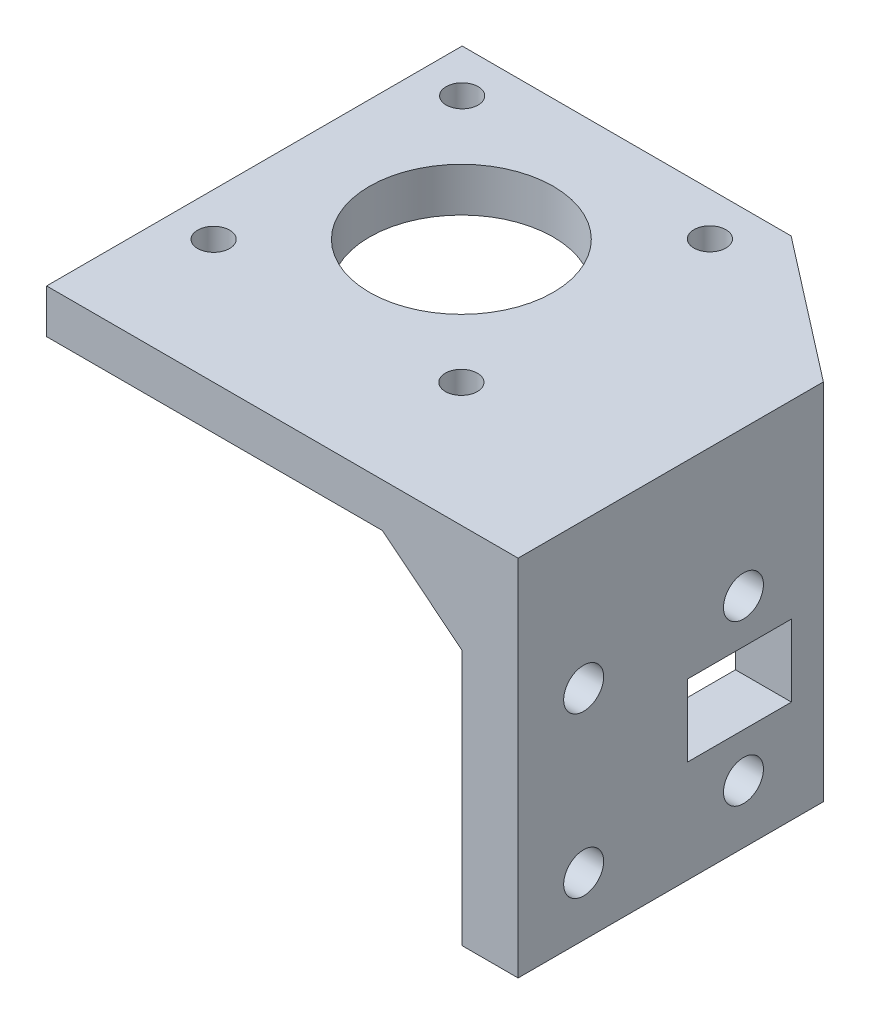
ISO-10303-21;
HEADER;
FILE_DESCRIPTION(('STEP AP214'),'2;1');
FILE_NAME('part.step','',(''),(''),'','','');
FILE_SCHEMA(('AUTOMOTIVE_DESIGN { 1 0 10303 214 1 1 1 1 }'));
ENDSEC;
DATA;
#1=APPLICATION_CONTEXT('core data for automotive mechanical design processes');
#2=APPLICATION_PROTOCOL_DEFINITION('international standard','automotive_design',2000,#1);
#3=PRODUCT_CONTEXT('',#1,'mechanical');
#4=PRODUCT('Part','Part','',(#3));
#5=PRODUCT_RELATED_PRODUCT_CATEGORY('part','',(#4));
#6=PRODUCT_DEFINITION_FORMATION('','',#4);
#7=PRODUCT_DEFINITION_CONTEXT('part definition',#1,'design');
#8=PRODUCT_DEFINITION('design','',#6,#7);
#9=PRODUCT_DEFINITION_SHAPE('','',#8);
#10=(LENGTH_UNIT() NAMED_UNIT(*) SI_UNIT(.MILLI.,.METRE.));
#11=(NAMED_UNIT(*) PLANE_ANGLE_UNIT() SI_UNIT($,.RADIAN.));
#12=(NAMED_UNIT(*) SI_UNIT($,.STERADIAN.) SOLID_ANGLE_UNIT());
#13=UNCERTAINTY_MEASURE_WITH_UNIT(LENGTH_MEASURE(1.E-05),#10,'distance_accuracy_value','');
#14=(GEOMETRIC_REPRESENTATION_CONTEXT(3) GLOBAL_UNCERTAINTY_ASSIGNED_CONTEXT((#13)) GLOBAL_UNIT_ASSIGNED_CONTEXT((#10,
#11,#12)) REPRESENTATION_CONTEXT('',''));
#15=CARTESIAN_POINT('',(0.,0.,0.));
#16=DIRECTION('',(0.,0.,1.));
#17=DIRECTION('',(1.,0.,0.));
#18=AXIS2_PLACEMENT_3D('',#15,#16,#17);
#19=CARTESIAN_POINT('',(0.,5.5,0.));
#20=DIRECTION('',(-1.,0.,0.));
#21=DIRECTION('',(0.,0.,1.));
#22=AXIS2_PLACEMENT_3D('',#19,#20,#21);
#23=PLANE('',#22);
#24=DIRECTION('',(0.,0.,-1.));
#25=VECTOR('',#24,1.);
#26=CARTESIAN_POINT('',(0.,-18.2,0.));
#27=LINE('',#26,#25);
#28=CARTESIAN_POINT('',(0.,-18.2,30.8));
#29=VERTEX_POINT('',#28);
#30=CARTESIAN_POINT('',(0.,-18.2,17.8));
#31=VERTEX_POINT('',#30);
#32=EDGE_CURVE('E155',#29,#31,#27,.T.);
#33=ORIENTED_EDGE('',*,*,#32,.T.);
#34=DIRECTION('',(0.,-1.,0.));
#35=VECTOR('',#34,1.);
#36=CARTESIAN_POINT('',(0.,5.5,17.8));
#37=LINE('',#36,#35);
#38=CARTESIAN_POINT('',(0.,-27.2,17.8));
#39=VERTEX_POINT('',#38);
#40=EDGE_CURVE('E158',#31,#39,#37,.T.);
#41=ORIENTED_EDGE('',*,*,#40,.T.);
#42=DIRECTION('',(0.,0.,1.));
#43=VECTOR('',#42,1.);
#44=CARTESIAN_POINT('',(0.,-27.2,0.));
#45=LINE('',#44,#43);
#46=CARTESIAN_POINT('',(0.,-27.2,30.8));
#47=VERTEX_POINT('',#46);
#48=EDGE_CURVE('E150',#39,#47,#45,.T.);
#49=ORIENTED_EDGE('',*,*,#48,.T.);
#50=DIRECTION('',(0.,1.,0.));
#51=VECTOR('',#50,1.);
#52=CARTESIAN_POINT('',(0.,5.50000000000001,30.8));
#53=LINE('',#52,#51);
#54=EDGE_CURVE('E130',#47,#29,#53,.T.);
#55=ORIENTED_EDGE('',*,*,#54,.T.);
#56=EDGE_LOOP('',(#33,#41,#49,#55));
#57=FACE_BOUND('',#56,.T.);
#58=CARTESIAN_POINT('',(0.,-12.7,43.8));
#59=DIRECTION('',(-1.,0.,0.));
#60=DIRECTION('',(0.,0.,1.));
#61=AXIS2_PLACEMENT_3D('',#58,#59,#60);
#62=CIRCLE('',#61,2.5);
#63=CARTESIAN_POINT('',(0.,-12.7,46.3));
#64=VERTEX_POINT('',#63);
#65=EDGE_CURVE('E210',#64,#64,#62,.T.);
#66=ORIENTED_EDGE('',*,*,#65,.T.);
#67=EDGE_LOOP('',(#66));
#68=FACE_BOUND('',#67,.T.);
#69=CARTESIAN_POINT('',(0.,-32.7,23.8));
#70=DIRECTION('',(-1.,0.,0.));
#71=DIRECTION('',(0.,0.,1.));
#72=AXIS2_PLACEMENT_3D('',#69,#70,#71);
#73=CIRCLE('',#72,2.5);
#74=CARTESIAN_POINT('',(0.,-32.7,26.3));
#75=VERTEX_POINT('',#74);
#76=EDGE_CURVE('E207',#75,#75,#73,.T.);
#77=ORIENTED_EDGE('',*,*,#76,.T.);
#78=EDGE_LOOP('',(#77));
#79=FACE_BOUND('',#78,.T.);
#80=CARTESIAN_POINT('',(0.,-12.7,23.8));
#81=DIRECTION('',(-1.,0.,0.));
#82=DIRECTION('',(0.,0.,1.));
#83=AXIS2_PLACEMENT_3D('',#80,#81,#82);
#84=CIRCLE('',#83,2.5);
#85=CARTESIAN_POINT('',(0.,-12.7,26.3));
#86=VERTEX_POINT('',#85);
#87=EDGE_CURVE('E204',#86,#86,#84,.T.);
#88=ORIENTED_EDGE('',*,*,#87,.T.);
#89=EDGE_LOOP('',(#88));
#90=FACE_BOUND('',#89,.T.);
#91=CARTESIAN_POINT('',(0.,-32.7,43.8));
#92=DIRECTION('',(-1.,0.,0.));
#93=DIRECTION('',(0.,0.,1.));
#94=AXIS2_PLACEMENT_3D('',#91,#92,#93);
#95=CIRCLE('',#94,2.5);
#96=CARTESIAN_POINT('',(0.,-32.7,46.3));
#97=VERTEX_POINT('',#96);
#98=EDGE_CURVE('E201',#97,#97,#95,.T.);
#99=ORIENTED_EDGE('',*,*,#98,.T.);
#100=EDGE_LOOP('',(#99));
#101=FACE_BOUND('',#100,.T.);
#102=DIRECTION('',(0.,1.,0.));
#103=VECTOR('',#102,1.);
#104=CARTESIAN_POINT('',(0.,5.5,13.8));
#105=LINE('',#104,#103);
#106=CARTESIAN_POINT('',(0.,-40.,13.8));
#107=VERTEX_POINT('',#106);
#108=CARTESIAN_POINT('',(0.,0.,13.8));
#109=VERTEX_POINT('',#108);
#110=EDGE_CURVE('E186',#107,#109,#105,.T.);
#111=ORIENTED_EDGE('',*,*,#110,.T.);
#112=DIRECTION('',(0.,-1.,0.));
#113=VECTOR('',#112,1.);
#114=CARTESIAN_POINT('',(0.,33.,13.8));
#115=LINE('',#114,#113);
#116=CARTESIAN_POINT('',(0.,5.5,13.8));
#117=VERTEX_POINT('',#116);
#118=EDGE_CURVE('E173',#117,#109,#115,.T.);
#119=ORIENTED_EDGE('',*,*,#118,.F.);
#120=DIRECTION('',(0.,0.,-1.));
#121=VECTOR('',#120,1.);
#122=CARTESIAN_POINT('',(0.,5.5,0.));
#123=LINE('',#122,#121);
#124=CARTESIAN_POINT('',(0.,5.5,52.));
#125=VERTEX_POINT('',#124);
#126=EDGE_CURVE('E236',#125,#117,#123,.T.);
#127=ORIENTED_EDGE('',*,*,#126,.F.);
#128=DIRECTION('',(0.,-1.,0.));
#129=VECTOR('',#128,1.);
#130=CARTESIAN_POINT('',(0.,5.5,52.));
#131=LINE('',#130,#129);
#132=CARTESIAN_POINT('',(0.,-40.,52.));
#133=VERTEX_POINT('',#132);
#134=EDGE_CURVE('E246',#125,#133,#131,.T.);
#135=ORIENTED_EDGE('',*,*,#134,.T.);
#136=DIRECTION('',(0.,0.,1.));
#137=VECTOR('',#136,1.);
#138=CARTESIAN_POINT('',(0.,-40.,0.));
#139=LINE('',#138,#137);
#140=EDGE_CURVE('E213',#107,#133,#139,.T.);
#141=ORIENTED_EDGE('',*,*,#140,.F.);
#142=EDGE_LOOP('',(#111,#119,#127,#135,#141));
#143=FACE_BOUND('',#142,.T.);
#144=ADVANCED_FACE('F33',(#57,#68,#79,#90,#101,#143),#23,.F.);
#145=CARTESIAN_POINT('',(0.,5.5,0.));
#146=DIRECTION('',(0.,0.,1.));
#147=DIRECTION('',(1.,0.,0.));
#148=AXIS2_PLACEMENT_3D('',#145,#146,#147);
#149=PLANE('',#148);
#150=DIRECTION('',(-1.,0.,0.));
#151=VECTOR('',#150,1.);
#152=CARTESIAN_POINT('',(0.,5.5,0.));
#153=LINE('',#152,#151);
#154=CARTESIAN_POINT('',(-17.836375113518,5.5,0.));
#155=VERTEX_POINT('',#154);
#156=CARTESIAN_POINT('',(-59.,5.5,0.));
#157=VERTEX_POINT('',#156);
#158=EDGE_CURVE('E239',#155,#157,#153,.T.);
#159=ORIENTED_EDGE('',*,*,#158,.F.);
#160=DIRECTION('',(0.,-1.,0.));
#161=VECTOR('',#160,1.);
#162=CARTESIAN_POINT('',(-17.836375113518,33.,0.));
#163=LINE('',#162,#161);
#164=CARTESIAN_POINT('',(-17.836375113518,0.,0.));
#165=VERTEX_POINT('',#164);
#166=EDGE_CURVE('E174',#155,#165,#163,.T.);
#167=ORIENTED_EDGE('',*,*,#166,.T.);
#168=DIRECTION('',(-1.,0.,0.));
#169=VECTOR('',#168,1.);
#170=CARTESIAN_POINT('',(0.,0.,0.));
#171=LINE('',#170,#169);
#172=CARTESIAN_POINT('',(-59.,0.,0.));
#173=VERTEX_POINT('',#172);
#174=EDGE_CURVE('E247',#165,#173,#171,.T.);
#175=ORIENTED_EDGE('',*,*,#174,.T.);
#176=DIRECTION('',(0.,-1.,0.));
#177=VECTOR('',#176,1.);
#178=CARTESIAN_POINT('',(-59.,5.5,0.));
#179=LINE('',#178,#177);
#180=EDGE_CURVE('E41',#157,#173,#179,.T.);
#181=ORIENTED_EDGE('',*,*,#180,.F.);
#182=EDGE_LOOP('',(#159,#167,#175,#181));
#183=FACE_BOUND('',#182,.T.);
#184=ADVANCED_FACE('F334',(#183),#149,.F.);
#185=CARTESIAN_POINT('',(-59.,5.5,0.));
#186=DIRECTION('',(1.,0.,0.));
#187=DIRECTION('',(0.,0.,-1.));
#188=AXIS2_PLACEMENT_3D('',#185,#186,#187);
#189=PLANE('',#188);
#190=DIRECTION('',(0.,0.,1.));
#191=VECTOR('',#190,1.);
#192=CARTESIAN_POINT('',(-59.,0.,0.));
#193=LINE('',#192,#191);
#194=CARTESIAN_POINT('',(-59.,0.,52.));
#195=VERTEX_POINT('',#194);
#196=EDGE_CURVE('E249',#173,#195,#193,.T.);
#197=ORIENTED_EDGE('',*,*,#196,.T.);
#198=DIRECTION('',(0.,-1.,0.));
#199=VECTOR('',#198,1.);
#200=CARTESIAN_POINT('',(-59.,5.5,52.));
#201=LINE('',#200,#199);
#202=CARTESIAN_POINT('',(-59.,5.5,52.));
#203=VERTEX_POINT('',#202);
#204=EDGE_CURVE('E256',#203,#195,#201,.T.);
#205=ORIENTED_EDGE('',*,*,#204,.F.);
#206=DIRECTION('',(0.,0.,1.));
#207=VECTOR('',#206,1.);
#208=CARTESIAN_POINT('',(-59.,5.5,0.));
#209=LINE('',#208,#207);
#210=EDGE_CURVE('E242',#157,#203,#209,.T.);
#211=ORIENTED_EDGE('',*,*,#210,.F.);
#212=ORIENTED_EDGE('',*,*,#180,.T.);
#213=EDGE_LOOP('',(#197,#205,#211,#212));
#214=FACE_BOUND('',#213,.T.);
#215=ADVANCED_FACE('F330',(#214),#189,.F.);
#216=CARTESIAN_POINT('',(0.,5.5,52.));
#217=DIRECTION('',(0.,0.,-1.));
#218=DIRECTION('',(-1.,0.,0.));
#219=AXIS2_PLACEMENT_3D('',#216,#217,#218);
#220=PLANE('',#219);
#221=DIRECTION('',(1.,0.,0.));
#222=VECTOR('',#221,1.);
#223=CARTESIAN_POINT('',(0.,0.,52.));
#224=LINE('',#223,#222);
#225=CARTESIAN_POINT('',(-17.,0.,52.));
#226=VERTEX_POINT('',#225);
#227=EDGE_CURVE('E240',#195,#226,#224,.T.);
#228=ORIENTED_EDGE('',*,*,#227,.T.);
#229=DIRECTION('',(0.78086880944303,-0.624695047554425,0.));
#230=VECTOR('',#229,1.);
#231=CARTESIAN_POINT('',(-7.00000000000001,-8.,52.));
#232=LINE('',#231,#230);
#233=CARTESIAN_POINT('',(-7.00000000000001,-8.,52.));
#234=VERTEX_POINT('',#233);
#235=EDGE_CURVE('E161',#226,#234,#232,.T.);
#236=ORIENTED_EDGE('',*,*,#235,.T.);
#237=DIRECTION('',(0.,1.,0.));
#238=VECTOR('',#237,1.);
#239=CARTESIAN_POINT('',(-7.00000000000001,-40.,52.));
#240=LINE('',#239,#238);
#241=CARTESIAN_POINT('',(-7.00000000000001,-40.,52.));
#242=VERTEX_POINT('',#241);
#243=EDGE_CURVE('E220',#242,#234,#240,.T.);
#244=ORIENTED_EDGE('',*,*,#243,.F.);
#245=DIRECTION('',(-1.,0.,0.));
#246=VECTOR('',#245,1.);
#247=CARTESIAN_POINT('',(0.,-40.,52.));
#248=LINE('',#247,#246);
#249=EDGE_CURVE('E215',#133,#242,#248,.T.);
#250=ORIENTED_EDGE('',*,*,#249,.F.);
#251=ORIENTED_EDGE('',*,*,#134,.F.);
#252=DIRECTION('',(1.,0.,0.));
#253=VECTOR('',#252,1.);
#254=CARTESIAN_POINT('',(0.,5.5,52.));
#255=LINE('',#254,#253);
#256=EDGE_CURVE('E244',#203,#125,#255,.T.);
#257=ORIENTED_EDGE('',*,*,#256,.F.);
#258=ORIENTED_EDGE('',*,*,#204,.T.);
#259=EDGE_LOOP('',(#228,#236,#244,#250,#251,#257,#258));
#260=FACE_BOUND('',#259,.T.);
#261=ADVANCED_FACE('F296',(#260),#220,.F.);
#262=CARTESIAN_POINT('',(0.,5.5,0.));
#263=DIRECTION('',(0.,-1.,0.));
#264=DIRECTION('',(0.,0.,-1.));
#265=AXIS2_PLACEMENT_3D('',#262,#263,#264);
#266=PLANE('',#265);
#267=CARTESIAN_POINT('',(-38.1,5.5,21.));
#268=DIRECTION('',(0.,1.,0.));
#269=DIRECTION('',(0.,0.,1.));
#270=AXIS2_PLACEMENT_3D('',#267,#268,#269);
#271=CIRCLE('',#270,11.5);
#272=CARTESIAN_POINT('',(-38.1,5.5,32.5));
#273=VERTEX_POINT('',#272);
#274=EDGE_CURVE('E403',#273,#273,#271,.T.);
#275=ORIENTED_EDGE('',*,*,#274,.F.);
#276=EDGE_LOOP('',(#275));
#277=FACE_BOUND('',#276,.T.);
#278=CARTESIAN_POINT('',(-22.6,5.5,5.4));
#279=DIRECTION('',(0.,1.,0.));
#280=DIRECTION('',(0.,0.,1.));
#281=AXIS2_PLACEMENT_3D('',#278,#279,#280);
#282=CIRCLE('',#281,2.);
#283=CARTESIAN_POINT('',(-22.6,5.5,7.4));
#284=VERTEX_POINT('',#283);
#285=EDGE_CURVE('E227',#284,#284,#282,.T.);
#286=ORIENTED_EDGE('',*,*,#285,.F.);
#287=EDGE_LOOP('',(#286));
#288=FACE_BOUND('',#287,.T.);
#289=CARTESIAN_POINT('',(-53.6,5.5,36.5));
#290=DIRECTION('',(0.,1.,0.));
#291=DIRECTION('',(0.,0.,1.));
#292=AXIS2_PLACEMENT_3D('',#289,#290,#291);
#293=CIRCLE('',#292,2.);
#294=CARTESIAN_POINT('',(-53.6,5.5,38.5));
#295=VERTEX_POINT('',#294);
#296=EDGE_CURVE('E226',#295,#295,#293,.T.);
#297=ORIENTED_EDGE('',*,*,#296,.F.);
#298=EDGE_LOOP('',(#297));
#299=FACE_BOUND('',#298,.T.);
#300=CARTESIAN_POINT('',(-22.6,5.5,36.5));
#301=DIRECTION('',(0.,1.,0.));
#302=DIRECTION('',(0.,0.,1.));
#303=AXIS2_PLACEMENT_3D('',#300,#301,#302);
#304=CIRCLE('',#303,2.);
#305=CARTESIAN_POINT('',(-22.6,5.5,38.5));
#306=VERTEX_POINT('',#305);
#307=EDGE_CURVE('E223',#306,#306,#304,.T.);
#308=ORIENTED_EDGE('',*,*,#307,.F.);
#309=EDGE_LOOP('',(#308));
#310=FACE_BOUND('',#309,.T.);
#311=CARTESIAN_POINT('',(-53.6,5.5,5.4));
#312=DIRECTION('',(0.,1.,0.));
#313=DIRECTION('',(0.,0.,1.));
#314=AXIS2_PLACEMENT_3D('',#311,#312,#313);
#315=CIRCLE('',#314,2.);
#316=CARTESIAN_POINT('',(-53.6,5.5,7.4));
#317=VERTEX_POINT('',#316);
#318=EDGE_CURVE('E230',#317,#317,#315,.T.);
#319=ORIENTED_EDGE('',*,*,#318,.F.);
#320=EDGE_LOOP('',(#319));
#321=FACE_BOUND('',#320,.T.);
#322=ORIENTED_EDGE('',*,*,#126,.T.);
#323=DIRECTION('',(-0.7909126979902,0.,-0.611929002546752));
#324=VECTOR('',#323,1.);
#325=CARTESIAN_POINT('',(-6.67895737368131,5.5,8.6324919626215));
#326=LINE('',#325,#324);
#327=EDGE_CURVE('E177',#117,#155,#326,.T.);
#328=ORIENTED_EDGE('',*,*,#327,.T.);
#329=ORIENTED_EDGE('',*,*,#158,.T.);
#330=ORIENTED_EDGE('',*,*,#210,.T.);
#331=ORIENTED_EDGE('',*,*,#256,.T.);
#332=EDGE_LOOP('',(#322,#328,#329,#330,#331));
#333=FACE_BOUND('',#332,.T.);
#334=ADVANCED_FACE('F279',(#277,#288,#299,#310,#321,#333),#266,.F.);
#335=CARTESIAN_POINT('',(0.,0.,0.));
#336=DIRECTION('',(0.,-1.,0.));
#337=DIRECTION('',(0.,0.,-1.));
#338=AXIS2_PLACEMENT_3D('',#335,#336,#337);
#339=PLANE('',#338);
#340=CARTESIAN_POINT('',(-38.1,0.,21.));
#341=DIRECTION('',(0.,-1.,0.));
#342=DIRECTION('',(0.,0.,-1.));
#343=AXIS2_PLACEMENT_3D('',#340,#341,#342);
#344=CIRCLE('',#343,11.5);
#345=CARTESIAN_POINT('',(-38.1,0.,9.50000000000001));
#346=VERTEX_POINT('',#345);
#347=EDGE_CURVE('E36',#346,#346,#344,.T.);
#348=ORIENTED_EDGE('',*,*,#347,.F.);
#349=EDGE_LOOP('',(#348));
#350=FACE_BOUND('',#349,.T.);
#351=DIRECTION('',(0.,0.,1.));
#352=VECTOR('',#351,1.);
#353=CARTESIAN_POINT('',(-17.,0.,13.8));
#354=LINE('',#353,#352);
#355=CARTESIAN_POINT('',(-17.,0.,13.8));
#356=VERTEX_POINT('',#355);
#357=EDGE_CURVE('E164',#356,#226,#354,.T.);
#358=ORIENTED_EDGE('',*,*,#357,.T.);
#359=ORIENTED_EDGE('',*,*,#227,.F.);
#360=ORIENTED_EDGE('',*,*,#196,.F.);
#361=ORIENTED_EDGE('',*,*,#174,.F.);
#362=DIRECTION('',(-0.7909126979902,0.,-0.611929002546752));
#363=VECTOR('',#362,1.);
#364=CARTESIAN_POINT('',(0.,0.,13.8));
#365=LINE('',#364,#363);
#366=EDGE_CURVE('E169',#109,#165,#365,.T.);
#367=ORIENTED_EDGE('',*,*,#366,.F.);
#368=DIRECTION('',(-1.,0.,0.));
#369=VECTOR('',#368,1.);
#370=CARTESIAN_POINT('',(26.,0.,13.8));
#371=LINE('',#370,#369);
#372=EDGE_CURVE('E184',#109,#356,#371,.T.);
#373=ORIENTED_EDGE('',*,*,#372,.T.);
#374=EDGE_LOOP('',(#358,#359,#360,#361,#367,#373));
#375=FACE_BOUND('',#374,.T.);
#376=CARTESIAN_POINT('',(-22.6,0.,5.4));
#377=DIRECTION('',(0.,-1.,0.));
#378=DIRECTION('',(0.,0.,-1.));
#379=AXIS2_PLACEMENT_3D('',#376,#377,#378);
#380=CIRCLE('',#379,2.);
#381=CARTESIAN_POINT('',(-22.6,0.,3.4));
#382=VERTEX_POINT('',#381);
#383=EDGE_CURVE('E250',#382,#382,#380,.T.);
#384=ORIENTED_EDGE('',*,*,#383,.F.);
#385=EDGE_LOOP('',(#384));
#386=FACE_BOUND('',#385,.T.);
#387=CARTESIAN_POINT('',(-53.6,0.,36.5));
#388=DIRECTION('',(0.,-1.,0.));
#389=DIRECTION('',(0.,0.,-1.));
#390=AXIS2_PLACEMENT_3D('',#387,#388,#389);
#391=CIRCLE('',#390,2.);
#392=CARTESIAN_POINT('',(-53.6,0.,34.5));
#393=VERTEX_POINT('',#392);
#394=EDGE_CURVE('E266',#393,#393,#391,.T.);
#395=ORIENTED_EDGE('',*,*,#394,.F.);
#396=EDGE_LOOP('',(#395));
#397=FACE_BOUND('',#396,.T.);
#398=CARTESIAN_POINT('',(-22.6,0.,36.5));
#399=DIRECTION('',(0.,-1.,0.));
#400=DIRECTION('',(0.,0.,-1.));
#401=AXIS2_PLACEMENT_3D('',#398,#399,#400);
#402=CIRCLE('',#401,2.);
#403=CARTESIAN_POINT('',(-22.6,0.,34.5));
#404=VERTEX_POINT('',#403);
#405=EDGE_CURVE('E263',#404,#404,#402,.T.);
#406=ORIENTED_EDGE('',*,*,#405,.F.);
#407=EDGE_LOOP('',(#406));
#408=FACE_BOUND('',#407,.T.);
#409=CARTESIAN_POINT('',(-53.6,0.,5.4));
#410=DIRECTION('',(0.,-1.,0.));
#411=DIRECTION('',(0.,0.,-1.));
#412=AXIS2_PLACEMENT_3D('',#409,#410,#411);
#413=CIRCLE('',#412,2.);
#414=CARTESIAN_POINT('',(-53.6,0.,3.4));
#415=VERTEX_POINT('',#414);
#416=EDGE_CURVE('E235',#415,#415,#413,.T.);
#417=ORIENTED_EDGE('',*,*,#416,.F.);
#418=EDGE_LOOP('',(#417));
#419=FACE_BOUND('',#418,.T.);
#420=ADVANCED_FACE('F275',(#350,#375,#386,#397,#408,#419),#339,.T.);
#421=CARTESIAN_POINT('',(-53.6,-4.5,5.4));
#422=DIRECTION('',(0.,1.,0.));
#423=DIRECTION('',(0.,0.,1.));
#424=AXIS2_PLACEMENT_3D('',#421,#422,#423);
#425=CYLINDRICAL_SURFACE('',#424,2.);
#426=ORIENTED_EDGE('',*,*,#416,.T.);
#427=EDGE_LOOP('',(#426));
#428=FACE_BOUND('',#427,.T.);
#429=ORIENTED_EDGE('',*,*,#318,.T.);
#430=EDGE_LOOP('',(#429));
#431=FACE_BOUND('',#430,.T.);
#432=ADVANCED_FACE('F278',(#428,#431),#425,.F.);
#433=CARTESIAN_POINT('',(-22.6,-4.5,36.5));
#434=DIRECTION('',(0.,1.,0.));
#435=DIRECTION('',(0.,0.,1.));
#436=AXIS2_PLACEMENT_3D('',#433,#434,#435);
#437=CYLINDRICAL_SURFACE('',#436,2.);
#438=ORIENTED_EDGE('',*,*,#405,.T.);
#439=EDGE_LOOP('',(#438));
#440=FACE_BOUND('',#439,.T.);
#441=ORIENTED_EDGE('',*,*,#307,.T.);
#442=EDGE_LOOP('',(#441));
#443=FACE_BOUND('',#442,.T.);
#444=ADVANCED_FACE('F290',(#440,#443),#437,.F.);
#445=CARTESIAN_POINT('',(-53.6,-4.5,36.5));
#446=DIRECTION('',(0.,1.,0.));
#447=DIRECTION('',(0.,0.,1.));
#448=AXIS2_PLACEMENT_3D('',#445,#446,#447);
#449=CYLINDRICAL_SURFACE('',#448,2.);
#450=ORIENTED_EDGE('',*,*,#394,.T.);
#451=EDGE_LOOP('',(#450));
#452=FACE_BOUND('',#451,.T.);
#453=ORIENTED_EDGE('',*,*,#296,.T.);
#454=EDGE_LOOP('',(#453));
#455=FACE_BOUND('',#454,.T.);
#456=ADVANCED_FACE('F345',(#452,#455),#449,.F.);
#457=CARTESIAN_POINT('',(-22.6,-4.5,5.4));
#458=DIRECTION('',(0.,1.,0.));
#459=DIRECTION('',(0.,0.,1.));
#460=AXIS2_PLACEMENT_3D('',#457,#458,#459);
#461=CYLINDRICAL_SURFACE('',#460,2.);
#462=ORIENTED_EDGE('',*,*,#383,.T.);
#463=EDGE_LOOP('',(#462));
#464=FACE_BOUND('',#463,.T.);
#465=ORIENTED_EDGE('',*,*,#285,.T.);
#466=EDGE_LOOP('',(#465));
#467=FACE_BOUND('',#466,.T.);
#468=ADVANCED_FACE('F272',(#464,#467),#461,.F.);
#469=CARTESIAN_POINT('',(-7.,-40.,0.));
#470=DIRECTION('',(1.,0.,0.));
#471=DIRECTION('',(0.,0.,-1.));
#472=AXIS2_PLACEMENT_3D('',#469,#470,#471);
#473=PLANE('',#472);
#474=DIRECTION('',(0.,0.,1.));
#475=VECTOR('',#474,1.);
#476=CARTESIAN_POINT('',(-7.,-27.2,17.8));
#477=LINE('',#476,#475);
#478=CARTESIAN_POINT('',(-7.,-27.2,17.8));
#479=VERTEX_POINT('',#478);
#480=CARTESIAN_POINT('',(-7.00000000000001,-27.2,30.8));
#481=VERTEX_POINT('',#480);
#482=EDGE_CURVE('E136',#479,#481,#477,.T.);
#483=ORIENTED_EDGE('',*,*,#482,.F.);
#484=DIRECTION('',(0.,-1.,0.));
#485=VECTOR('',#484,1.);
#486=CARTESIAN_POINT('',(-7.,-18.2,17.8));
#487=LINE('',#486,#485);
#488=CARTESIAN_POINT('',(-7.,-18.2,17.8));
#489=VERTEX_POINT('',#488);
#490=EDGE_CURVE('E56',#489,#479,#487,.T.);
#491=ORIENTED_EDGE('',*,*,#490,.F.);
#492=DIRECTION('',(0.,0.,-1.));
#493=VECTOR('',#492,1.);
#494=CARTESIAN_POINT('',(-7.,-18.2,17.8));
#495=LINE('',#494,#493);
#496=CARTESIAN_POINT('',(-7.00000000000001,-18.2,30.8));
#497=VERTEX_POINT('',#496);
#498=EDGE_CURVE('E143',#497,#489,#495,.T.);
#499=ORIENTED_EDGE('',*,*,#498,.F.);
#500=DIRECTION('',(0.,1.,0.));
#501=VECTOR('',#500,1.);
#502=CARTESIAN_POINT('',(-7.00000000000001,-18.2,30.8));
#503=LINE('',#502,#501);
#504=EDGE_CURVE('E127',#481,#497,#503,.T.);
#505=ORIENTED_EDGE('',*,*,#504,.F.);
#506=EDGE_LOOP('',(#483,#491,#499,#505));
#507=FACE_BOUND('',#506,.T.);
#508=CARTESIAN_POINT('',(-7.00000000000001,-12.7,43.8));
#509=DIRECTION('',(-1.,0.,0.));
#510=DIRECTION('',(0.,0.,1.));
#511=AXIS2_PLACEMENT_3D('',#508,#509,#510);
#512=CIRCLE('',#511,2.5);
#513=CARTESIAN_POINT('',(-7.00000000000001,-12.7,46.3));
#514=VERTEX_POINT('',#513);
#515=EDGE_CURVE('E193',#514,#514,#512,.T.);
#516=ORIENTED_EDGE('',*,*,#515,.F.);
#517=EDGE_LOOP('',(#516));
#518=FACE_BOUND('',#517,.T.);
#519=CARTESIAN_POINT('',(-7.,-32.7,23.8));
#520=DIRECTION('',(-1.,0.,0.));
#521=DIRECTION('',(0.,0.,1.));
#522=AXIS2_PLACEMENT_3D('',#519,#520,#521);
#523=CIRCLE('',#522,2.5);
#524=CARTESIAN_POINT('',(-7.00000000000001,-32.7,26.3));
#525=VERTEX_POINT('',#524);
#526=EDGE_CURVE('E192',#525,#525,#523,.T.);
#527=ORIENTED_EDGE('',*,*,#526,.F.);
#528=EDGE_LOOP('',(#527));
#529=FACE_BOUND('',#528,.T.);
#530=CARTESIAN_POINT('',(-7.,-12.7,23.8));
#531=DIRECTION('',(-1.,0.,0.));
#532=DIRECTION('',(0.,0.,1.));
#533=AXIS2_PLACEMENT_3D('',#530,#531,#532);
#534=CIRCLE('',#533,2.5);
#535=CARTESIAN_POINT('',(-7.00000000000001,-12.7,26.3));
#536=VERTEX_POINT('',#535);
#537=EDGE_CURVE('E189',#536,#536,#534,.T.);
#538=ORIENTED_EDGE('',*,*,#537,.F.);
#539=EDGE_LOOP('',(#538));
#540=FACE_BOUND('',#539,.T.);
#541=CARTESIAN_POINT('',(-7.00000000000001,-32.7,43.8));
#542=DIRECTION('',(-1.,0.,0.));
#543=DIRECTION('',(0.,0.,1.));
#544=AXIS2_PLACEMENT_3D('',#541,#542,#543);
#545=CIRCLE('',#544,2.5);
#546=CARTESIAN_POINT('',(-7.00000000000001,-32.7,46.3));
#547=VERTEX_POINT('',#546);
#548=EDGE_CURVE('E196',#547,#547,#545,.T.);
#549=ORIENTED_EDGE('',*,*,#548,.F.);
#550=EDGE_LOOP('',(#549));
#551=FACE_BOUND('',#550,.T.);
#552=ORIENTED_EDGE('',*,*,#243,.T.);
#553=DIRECTION('',(0.,0.,1.));
#554=VECTOR('',#553,1.);
#555=CARTESIAN_POINT('',(-7.00000000000001,-8.,13.8));
#556=LINE('',#555,#554);
#557=CARTESIAN_POINT('',(-7.00000000000001,-8.,13.8));
#558=VERTEX_POINT('',#557);
#559=EDGE_CURVE('E167',#558,#234,#556,.T.);
#560=ORIENTED_EDGE('',*,*,#559,.F.);
#561=DIRECTION('',(0.,1.,0.));
#562=VECTOR('',#561,1.);
#563=CARTESIAN_POINT('',(-7.,-40.,13.8));
#564=LINE('',#563,#562);
#565=CARTESIAN_POINT('',(-7.,-40.,13.8));
#566=VERTEX_POINT('',#565);
#567=EDGE_CURVE('E181',#566,#558,#564,.T.);
#568=ORIENTED_EDGE('',*,*,#567,.F.);
#569=DIRECTION('',(0.,0.,-1.));
#570=VECTOR('',#569,1.);
#571=CARTESIAN_POINT('',(-7.,-40.,0.));
#572=LINE('',#571,#570);
#573=EDGE_CURVE('E217',#242,#566,#572,.T.);
#574=ORIENTED_EDGE('',*,*,#573,.F.);
#575=EDGE_LOOP('',(#552,#560,#568,#574));
#576=FACE_BOUND('',#575,.T.);
#577=ADVANCED_FACE('F140',(#507,#518,#529,#540,#551,#576),#473,.F.);
#578=CARTESIAN_POINT('',(0.,-40.,0.));
#579=DIRECTION('',(0.,-1.,0.));
#580=DIRECTION('',(0.,0.,-1.));
#581=AXIS2_PLACEMENT_3D('',#578,#579,#580);
#582=PLANE('',#581);
#583=DIRECTION('',(-1.,0.,0.));
#584=VECTOR('',#583,1.);
#585=CARTESIAN_POINT('',(0.,-40.,13.8));
#586=LINE('',#585,#584);
#587=EDGE_CURVE('E11',#107,#566,#586,.T.);
#588=ORIENTED_EDGE('',*,*,#587,.F.);
#589=ORIENTED_EDGE('',*,*,#140,.T.);
#590=ORIENTED_EDGE('',*,*,#249,.T.);
#591=ORIENTED_EDGE('',*,*,#573,.T.);
#592=EDGE_LOOP('',(#588,#589,#590,#591));
#593=FACE_BOUND('',#592,.T.);
#594=ADVANCED_FACE('F356',(#593),#582,.T.);
#595=CARTESIAN_POINT('',(26.,-32.7,43.8));
#596=DIRECTION('',(-1.,0.,0.));
#597=DIRECTION('',(0.,0.,1.));
#598=AXIS2_PLACEMENT_3D('',#595,#596,#597);
#599=CYLINDRICAL_SURFACE('',#598,2.5);
#600=ORIENTED_EDGE('',*,*,#548,.T.);
#601=EDGE_LOOP('',(#600));
#602=FACE_BOUND('',#601,.T.);
#603=ORIENTED_EDGE('',*,*,#98,.F.);
#604=EDGE_LOOP('',(#603));
#605=FACE_BOUND('',#604,.T.);
#606=ADVANCED_FACE('F359',(#602,#605),#599,.F.);
#607=CARTESIAN_POINT('',(26.,-12.7,23.8));
#608=DIRECTION('',(-1.,0.,0.));
#609=DIRECTION('',(0.,0.,1.));
#610=AXIS2_PLACEMENT_3D('',#607,#608,#609);
#611=CYLINDRICAL_SURFACE('',#610,2.5);
#612=ORIENTED_EDGE('',*,*,#537,.T.);
#613=EDGE_LOOP('',(#612));
#614=FACE_BOUND('',#613,.T.);
#615=ORIENTED_EDGE('',*,*,#87,.F.);
#616=EDGE_LOOP('',(#615));
#617=FACE_BOUND('',#616,.T.);
#618=ADVANCED_FACE('F363',(#614,#617),#611,.F.);
#619=CARTESIAN_POINT('',(26.,-32.7,23.8));
#620=DIRECTION('',(-1.,0.,0.));
#621=DIRECTION('',(0.,0.,1.));
#622=AXIS2_PLACEMENT_3D('',#619,#620,#621);
#623=CYLINDRICAL_SURFACE('',#622,2.5);
#624=ORIENTED_EDGE('',*,*,#526,.T.);
#625=EDGE_LOOP('',(#624));
#626=FACE_BOUND('',#625,.T.);
#627=ORIENTED_EDGE('',*,*,#76,.F.);
#628=EDGE_LOOP('',(#627));
#629=FACE_BOUND('',#628,.T.);
#630=ADVANCED_FACE('F365',(#626,#629),#623,.F.);
#631=CARTESIAN_POINT('',(26.,-12.7,43.8));
#632=DIRECTION('',(-1.,0.,0.));
#633=DIRECTION('',(0.,0.,1.));
#634=AXIS2_PLACEMENT_3D('',#631,#632,#633);
#635=CYLINDRICAL_SURFACE('',#634,2.5);
#636=ORIENTED_EDGE('',*,*,#515,.T.);
#637=EDGE_LOOP('',(#636));
#638=FACE_BOUND('',#637,.T.);
#639=ORIENTED_EDGE('',*,*,#65,.F.);
#640=EDGE_LOOP('',(#639));
#641=FACE_BOUND('',#640,.T.);
#642=ADVANCED_FACE('F368',(#638,#641),#635,.F.);
#643=CARTESIAN_POINT('',(26.,-40.,13.8));
#644=DIRECTION('',(0.,0.,1.));
#645=DIRECTION('',(1.,0.,0.));
#646=AXIS2_PLACEMENT_3D('',#643,#644,#645);
#647=PLANE('',#646);
#648=ORIENTED_EDGE('',*,*,#587,.T.);
#649=ORIENTED_EDGE('',*,*,#567,.T.);
#650=DIRECTION('',(0.78086880944303,-0.624695047554425,0.));
#651=VECTOR('',#650,1.);
#652=CARTESIAN_POINT('',(-7.00000000000001,-8.,13.8));
#653=LINE('',#652,#651);
#654=EDGE_CURVE('E162',#356,#558,#653,.T.);
#655=ORIENTED_EDGE('',*,*,#654,.F.);
#656=ORIENTED_EDGE('',*,*,#372,.F.);
#657=ORIENTED_EDGE('',*,*,#110,.F.);
#658=EDGE_LOOP('',(#648,#649,#655,#656,#657));
#659=FACE_BOUND('',#658,.T.);
#660=ADVANCED_FACE('F317',(#659),#647,.F.);
#661=CARTESIAN_POINT('',(0.,33.,13.8));
#662=DIRECTION('',(-0.611929002546752,0.,0.7909126979902));
#663=DIRECTION('',(0.7909126979902,0.,0.611929002546752));
#664=AXIS2_PLACEMENT_3D('',#661,#662,#663);
#665=PLANE('',#664);
#666=ORIENTED_EDGE('',*,*,#118,.T.);
#667=ORIENTED_EDGE('',*,*,#366,.T.);
#668=ORIENTED_EDGE('',*,*,#166,.F.);
#669=ORIENTED_EDGE('',*,*,#327,.F.);
#670=EDGE_LOOP('',(#666,#667,#668,#669));
#671=FACE_BOUND('',#670,.T.);
#672=ADVANCED_FACE('F309',(#671),#665,.F.);
#673=CARTESIAN_POINT('',(-7.00000000000001,-8.,13.8));
#674=DIRECTION('',(-0.624695047554424,-0.78086880944303,0.));
#675=DIRECTION('',(0.78086880944303,-0.624695047554425,0.));
#676=AXIS2_PLACEMENT_3D('',#673,#674,#675);
#677=PLANE('',#676);
#678=ORIENTED_EDGE('',*,*,#235,.F.);
#679=ORIENTED_EDGE('',*,*,#357,.F.);
#680=ORIENTED_EDGE('',*,*,#654,.T.);
#681=ORIENTED_EDGE('',*,*,#559,.T.);
#682=EDGE_LOOP('',(#678,#679,#680,#681));
#683=FACE_BOUND('',#682,.T.);
#684=ADVANCED_FACE('F322',(#683),#677,.T.);
#685=CARTESIAN_POINT('',(3.,-18.2,17.8));
#686=DIRECTION('',(0.,0.,-1.));
#687=DIRECTION('',(-1.,0.,0.));
#688=AXIS2_PLACEMENT_3D('',#685,#686,#687);
#689=PLANE('',#688);
#690=DIRECTION('',(-1.,0.,0.));
#691=VECTOR('',#690,1.);
#692=CARTESIAN_POINT('',(3.,-18.2,17.8));
#693=LINE('',#692,#691);
#694=EDGE_CURVE('E148',#31,#489,#693,.T.);
#695=ORIENTED_EDGE('',*,*,#694,.T.);
#696=ORIENTED_EDGE('',*,*,#490,.T.);
#697=DIRECTION('',(-1.,0.,0.));
#698=VECTOR('',#697,1.);
#699=CARTESIAN_POINT('',(3.,-27.2,17.8));
#700=LINE('',#699,#698);
#701=EDGE_CURVE('E133',#39,#479,#700,.T.);
#702=ORIENTED_EDGE('',*,*,#701,.F.);
#703=ORIENTED_EDGE('',*,*,#40,.F.);
#704=EDGE_LOOP('',(#695,#696,#702,#703));
#705=FACE_BOUND('',#704,.T.);
#706=ADVANCED_FACE('F382',(#705),#689,.F.);
#707=CARTESIAN_POINT('',(3.,-18.2,17.8));
#708=DIRECTION('',(0.,1.,0.));
#709=DIRECTION('',(0.,0.,1.));
#710=AXIS2_PLACEMENT_3D('',#707,#708,#709);
#711=PLANE('',#710);
#712=DIRECTION('',(-1.,0.,0.));
#713=VECTOR('',#712,1.);
#714=CARTESIAN_POINT('',(2.99999999999999,-18.2,30.8));
#715=LINE('',#714,#713);
#716=EDGE_CURVE('E132',#29,#497,#715,.T.);
#717=ORIENTED_EDGE('',*,*,#716,.T.);
#718=ORIENTED_EDGE('',*,*,#498,.T.);
#719=ORIENTED_EDGE('',*,*,#694,.F.);
#720=ORIENTED_EDGE('',*,*,#32,.F.);
#721=EDGE_LOOP('',(#717,#718,#719,#720));
#722=FACE_BOUND('',#721,.T.);
#723=ADVANCED_FACE('F385',(#722),#711,.F.);
#724=CARTESIAN_POINT('',(2.99999999999999,-18.2,30.8));
#725=DIRECTION('',(0.,0.,1.));
#726=DIRECTION('',(0.,-1.,0.));
#727=AXIS2_PLACEMENT_3D('',#724,#725,#726);
#728=PLANE('',#727);
#729=DIRECTION('',(-1.,0.,0.));
#730=VECTOR('',#729,1.);
#731=CARTESIAN_POINT('',(2.99999999999999,-27.2,30.8));
#732=LINE('',#731,#730);
#733=EDGE_CURVE('E48',#47,#481,#732,.T.);
#734=ORIENTED_EDGE('',*,*,#733,.T.);
#735=ORIENTED_EDGE('',*,*,#504,.T.);
#736=ORIENTED_EDGE('',*,*,#716,.F.);
#737=ORIENTED_EDGE('',*,*,#54,.F.);
#738=EDGE_LOOP('',(#734,#735,#736,#737));
#739=FACE_BOUND('',#738,.T.);
#740=ADVANCED_FACE('F124',(#739),#728,.F.);
#741=CARTESIAN_POINT('',(3.,-27.2,17.8));
#742=DIRECTION('',(0.,-1.,0.));
#743=DIRECTION('',(0.,0.,-1.));
#744=AXIS2_PLACEMENT_3D('',#741,#742,#743);
#745=PLANE('',#744);
#746=ORIENTED_EDGE('',*,*,#701,.T.);
#747=ORIENTED_EDGE('',*,*,#482,.T.);
#748=ORIENTED_EDGE('',*,*,#733,.F.);
#749=ORIENTED_EDGE('',*,*,#48,.F.);
#750=EDGE_LOOP('',(#746,#747,#748,#749));
#751=FACE_BOUND('',#750,.T.);
#752=ADVANCED_FACE('F137',(#751),#745,.F.);
#753=CARTESIAN_POINT('',(-38.1,-4.5,21.));
#754=DIRECTION('',(0.,1.,0.));
#755=DIRECTION('',(0.,0.,1.));
#756=AXIS2_PLACEMENT_3D('',#753,#754,#755);
#757=CYLINDRICAL_SURFACE('',#756,11.5);
#758=ORIENTED_EDGE('',*,*,#347,.T.);
#759=EDGE_LOOP('',(#758));
#760=FACE_BOUND('',#759,.T.);
#761=ORIENTED_EDGE('',*,*,#274,.T.);
#762=EDGE_LOOP('',(#761));
#763=FACE_BOUND('',#762,.T.);
#764=ADVANCED_FACE('F388',(#760,#763),#757,.F.);
#765=CLOSED_SHELL('',(#144,#184,#215,#261,#334,#420,#432,#444,#456,#468,#577,#594,#606,#618,
#630,#642,#660,#672,#684,#706,#723,#740,#752,#764));
#766=MANIFOLD_SOLID_BREP('B2',#765);
#767=ADVANCED_BREP_SHAPE_REPRESENTATION('',(#18,#766),#14);
#768=SHAPE_DEFINITION_REPRESENTATION(#9,#767);
ENDSEC;
END-ISO-10303-21;
